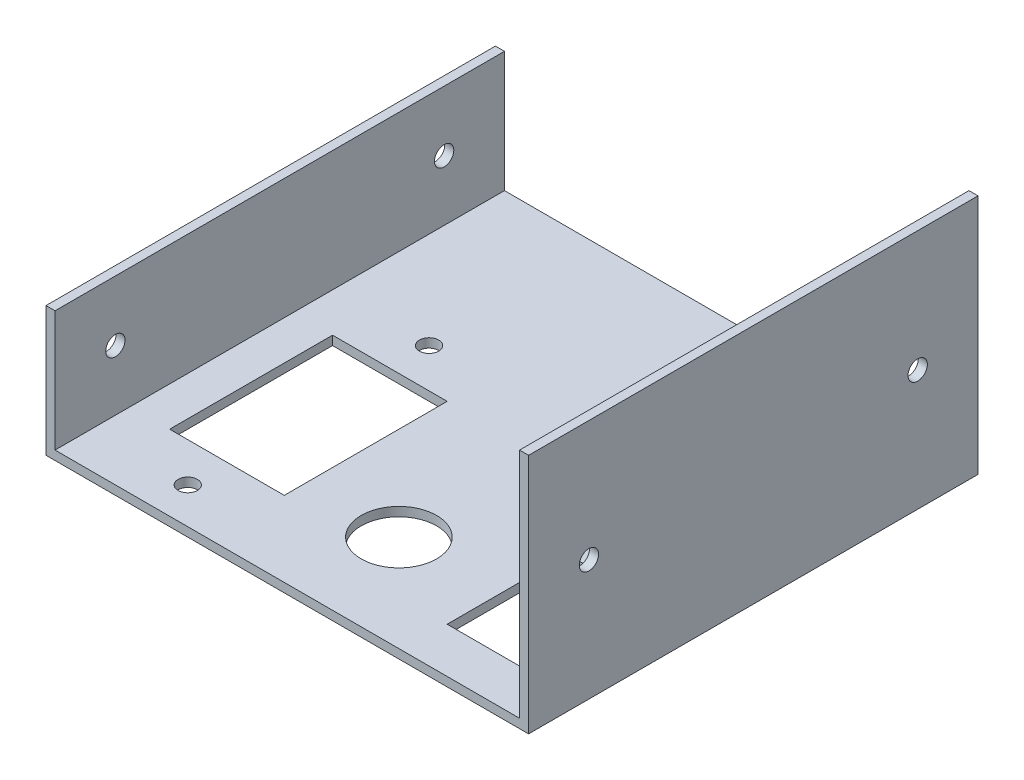
ISO-10303-21;
HEADER;
FILE_DESCRIPTION(('STEP AP214'),'2;1');
FILE_NAME('part.step','',(''),(''),'','','');
FILE_SCHEMA(('AUTOMOTIVE_DESIGN { 1 0 10303 214 1 1 1 1 }'));
ENDSEC;
DATA;
#1=APPLICATION_CONTEXT('core data for automotive mechanical design processes');
#2=APPLICATION_PROTOCOL_DEFINITION('international standard','automotive_design',2000,#1);
#3=PRODUCT_CONTEXT('',#1,'mechanical');
#4=PRODUCT('Part','Part','',(#3));
#5=PRODUCT_RELATED_PRODUCT_CATEGORY('part','',(#4));
#6=PRODUCT_DEFINITION_FORMATION('','',#4);
#7=PRODUCT_DEFINITION_CONTEXT('part definition',#1,'design');
#8=PRODUCT_DEFINITION('design','',#6,#7);
#9=PRODUCT_DEFINITION_SHAPE('','',#8);
#10=(LENGTH_UNIT() NAMED_UNIT(*) SI_UNIT(.MILLI.,.METRE.));
#11=(NAMED_UNIT(*) PLANE_ANGLE_UNIT() SI_UNIT($,.RADIAN.));
#12=(NAMED_UNIT(*) SI_UNIT($,.STERADIAN.) SOLID_ANGLE_UNIT());
#13=UNCERTAINTY_MEASURE_WITH_UNIT(LENGTH_MEASURE(1.E-05),#10,'distance_accuracy_value','');
#14=(GEOMETRIC_REPRESENTATION_CONTEXT(3) GLOBAL_UNCERTAINTY_ASSIGNED_CONTEXT((#13)) GLOBAL_UNIT_ASSIGNED_CONTEXT((#10,
#11,#12)) REPRESENTATION_CONTEXT('',''));
#15=CARTESIAN_POINT('',(0.,0.,0.));
#16=DIRECTION('',(0.,0.,1.));
#17=DIRECTION('',(1.,0.,0.));
#18=AXIS2_PLACEMENT_3D('',#15,#16,#17);
#19=CARTESIAN_POINT('',(0.,1.5,0.));
#20=DIRECTION('',(0.,-1.,0.));
#21=DIRECTION('',(0.,0.,-1.));
#22=AXIS2_PLACEMENT_3D('',#19,#20,#21);
#23=PLANE('',#22);
#24=DIRECTION('',(1.,0.,0.));
#25=VECTOR('',#24,1.);
#26=CARTESIAN_POINT('',(19.,1.5,29.75));
#27=LINE('',#26,#25);
#28=CARTESIAN_POINT('',(19.,1.5,29.75));
#29=VERTEX_POINT('',#28);
#30=CARTESIAN_POINT('',(31.,1.5,29.75));
#31=VERTEX_POINT('',#30);
#32=EDGE_CURVE('E160',#29,#31,#27,.T.);
#33=ORIENTED_EDGE('',*,*,#32,.F.);
#34=DIRECTION('',(0.,0.,1.));
#35=VECTOR('',#34,1.);
#36=CARTESIAN_POINT('',(19.,1.5,9.74999999999999));
#37=LINE('',#36,#35);
#38=CARTESIAN_POINT('',(19.,1.5,9.74999999999999));
#39=VERTEX_POINT('',#38);
#40=EDGE_CURVE('E51',#39,#29,#37,.T.);
#41=ORIENTED_EDGE('',*,*,#40,.F.);
#42=DIRECTION('',(-1.,0.,0.));
#43=VECTOR('',#42,1.);
#44=CARTESIAN_POINT('',(19.,1.5,9.74999999999999));
#45=LINE('',#44,#43);
#46=CARTESIAN_POINT('',(31.,1.5,9.74999999999999));
#47=VERTEX_POINT('',#46);
#48=EDGE_CURVE('E166',#47,#39,#45,.T.);
#49=ORIENTED_EDGE('',*,*,#48,.F.);
#50=DIRECTION('',(0.,0.,-1.));
#51=VECTOR('',#50,1.);
#52=CARTESIAN_POINT('',(31.,1.5,9.74999999999999));
#53=LINE('',#52,#51);
#54=EDGE_CURVE('E151',#31,#47,#53,.T.);
#55=ORIENTED_EDGE('',*,*,#54,.F.);
#56=EDGE_LOOP('',(#33,#41,#49,#55));
#57=FACE_BOUND('',#56,.T.);
#58=CARTESIAN_POINT('',(2.50000000000001,1.5,21.25));
#59=DIRECTION('',(0.,1.,0.));
#60=DIRECTION('',(0.,0.,1.));
#61=AXIS2_PLACEMENT_3D('',#58,#59,#60);
#62=CIRCLE('',#61,6.25);
#63=CARTESIAN_POINT('',(2.50000000000001,1.5,27.5));
#64=VERTEX_POINT('',#63);
#65=EDGE_CURVE('E173',#64,#64,#62,.T.);
#66=ORIENTED_EDGE('',*,*,#65,.F.);
#67=EDGE_LOOP('',(#66));
#68=FACE_BOUND('',#67,.T.);
#69=CARTESIAN_POINT('',(-22.5,1.5,31.25));
#70=DIRECTION('',(0.,1.,0.));
#71=DIRECTION('',(0.,0.,1.));
#72=AXIS2_PLACEMENT_3D('',#69,#70,#71);
#73=CIRCLE('',#72,1.6);
#74=CARTESIAN_POINT('',(-22.5,1.5,32.85));
#75=VERTEX_POINT('',#74);
#76=EDGE_CURVE('E179',#75,#75,#73,.T.);
#77=ORIENTED_EDGE('',*,*,#76,.F.);
#78=EDGE_LOOP('',(#77));
#79=FACE_BOUND('',#78,.T.);
#80=CARTESIAN_POINT('',(-22.5,1.5,-8.75000000000001));
#81=DIRECTION('',(0.,1.,0.));
#82=DIRECTION('',(0.,0.,1.));
#83=AXIS2_PLACEMENT_3D('',#80,#81,#82);
#84=CIRCLE('',#83,1.6);
#85=CARTESIAN_POINT('',(-22.5,1.5,-7.15000000000001));
#86=VERTEX_POINT('',#85);
#87=EDGE_CURVE('E183',#86,#86,#84,.T.);
#88=ORIENTED_EDGE('',*,*,#87,.F.);
#89=EDGE_LOOP('',(#88));
#90=FACE_BOUND('',#89,.T.);
#91=DIRECTION('',(1.,0.,0.));
#92=VECTOR('',#91,1.);
#93=CARTESIAN_POINT('',(-32.,1.5,24.75));
#94=LINE('',#93,#92);
#95=CARTESIAN_POINT('',(-32.,1.5,24.75));
#96=VERTEX_POINT('',#95);
#97=CARTESIAN_POINT('',(-13.,1.5,24.75));
#98=VERTEX_POINT('',#97);
#99=EDGE_CURVE('E189',#96,#98,#94,.T.);
#100=ORIENTED_EDGE('',*,*,#99,.F.);
#101=DIRECTION('',(0.,0.,1.));
#102=VECTOR('',#101,1.);
#103=CARTESIAN_POINT('',(-32.,1.5,-2.25));
#104=LINE('',#103,#102);
#105=CARTESIAN_POINT('',(-32.,1.5,-2.25));
#106=VERTEX_POINT('',#105);
#107=EDGE_CURVE('E187',#106,#96,#104,.T.);
#108=ORIENTED_EDGE('',*,*,#107,.F.);
#109=DIRECTION('',(-1.,0.,0.));
#110=VECTOR('',#109,1.);
#111=CARTESIAN_POINT('',(-32.,1.5,-2.25));
#112=LINE('',#111,#110);
#113=CARTESIAN_POINT('',(-13.,1.5,-2.25000000000001));
#114=VERTEX_POINT('',#113);
#115=EDGE_CURVE('E195',#114,#106,#112,.T.);
#116=ORIENTED_EDGE('',*,*,#115,.F.);
#117=DIRECTION('',(0.,0.,-1.));
#118=VECTOR('',#117,1.);
#119=CARTESIAN_POINT('',(-13.,1.5,-2.25000000000001));
#120=LINE('',#119,#118);
#121=EDGE_CURVE('E192',#98,#114,#120,.T.);
#122=ORIENTED_EDGE('',*,*,#121,.F.);
#123=EDGE_LOOP('',(#100,#108,#116,#122));
#124=FACE_BOUND('',#123,.T.);
#125=DIRECTION('',(0.,0.,1.));
#126=VECTOR('',#125,1.);
#127=CARTESIAN_POINT('',(38.5,1.5,-37.25));
#128=LINE('',#127,#126);
#129=CARTESIAN_POINT('',(38.5,1.5,-37.25));
#130=VERTEX_POINT('',#129);
#131=CARTESIAN_POINT('',(38.5,1.5,37.25));
#132=VERTEX_POINT('',#131);
#133=EDGE_CURVE('E201',#130,#132,#128,.T.);
#134=ORIENTED_EDGE('',*,*,#133,.F.);
#135=DIRECTION('',(-1.,0.,0.));
#136=VECTOR('',#135,1.);
#137=CARTESIAN_POINT('',(-40.,1.5,-37.25));
#138=LINE('',#137,#136);
#139=CARTESIAN_POINT('',(-38.5,1.5,-37.25));
#140=VERTEX_POINT('',#139);
#141=EDGE_CURVE('E258',#130,#140,#138,.T.);
#142=ORIENTED_EDGE('',*,*,#141,.T.);
#143=DIRECTION('',(0.,0.,-1.));
#144=VECTOR('',#143,1.);
#145=CARTESIAN_POINT('',(-38.5,1.5,-37.25));
#146=LINE('',#145,#144);
#147=CARTESIAN_POINT('',(-38.5,1.5,37.25));
#148=VERTEX_POINT('',#147);
#149=EDGE_CURVE('E226',#148,#140,#146,.T.);
#150=ORIENTED_EDGE('',*,*,#149,.F.);
#151=DIRECTION('',(1.,0.,0.));
#152=VECTOR('',#151,1.);
#153=CARTESIAN_POINT('',(-40.,1.5,37.25));
#154=LINE('',#153,#152);
#155=EDGE_CURVE('E246',#148,#132,#154,.T.);
#156=ORIENTED_EDGE('',*,*,#155,.T.);
#157=EDGE_LOOP('',(#134,#142,#150,#156));
#158=FACE_BOUND('',#157,.T.);
#159=ADVANCED_FACE('F34',(#57,#68,#79,#90,#124,#158),#23,.F.);
#160=CARTESIAN_POINT('',(40.,1.5,37.25));
#161=DIRECTION('',(-1.,0.,0.));
#162=DIRECTION('',(0.,0.,1.));
#163=AXIS2_PLACEMENT_3D('',#160,#161,#162);
#164=PLANE('',#163);
#165=CARTESIAN_POINT('',(40.,20.,-27.25));
#166=DIRECTION('',(1.,0.,0.));
#167=DIRECTION('',(0.,0.,-1.));
#168=AXIS2_PLACEMENT_3D('',#165,#166,#167);
#169=CIRCLE('',#168,1.6);
#170=CARTESIAN_POINT('',(40.,20.,-28.85));
#171=VERTEX_POINT('',#170);
#172=EDGE_CURVE('E300',#171,#171,#169,.T.);
#173=ORIENTED_EDGE('',*,*,#172,.F.);
#174=EDGE_LOOP('',(#173));
#175=FACE_BOUND('',#174,.T.);
#176=CARTESIAN_POINT('',(40.,20.,27.25));
#177=DIRECTION('',(1.,0.,0.));
#178=DIRECTION('',(0.,0.,-1.));
#179=AXIS2_PLACEMENT_3D('',#176,#177,#178);
#180=CIRCLE('',#179,1.6);
#181=CARTESIAN_POINT('',(40.,20.,25.65));
#182=VERTEX_POINT('',#181);
#183=EDGE_CURVE('E290',#182,#182,#180,.T.);
#184=ORIENTED_EDGE('',*,*,#183,.F.);
#185=EDGE_LOOP('',(#184));
#186=FACE_BOUND('',#185,.T.);
#187=DIRECTION('',(0.,0.,-1.));
#188=VECTOR('',#187,1.);
#189=CARTESIAN_POINT('',(40.,0.,37.25));
#190=LINE('',#189,#188);
#191=CARTESIAN_POINT('',(40.,0.,37.25));
#192=VERTEX_POINT('',#191);
#193=CARTESIAN_POINT('',(40.,0.,-37.25));
#194=VERTEX_POINT('',#193);
#195=EDGE_CURVE('E255',#192,#194,#190,.T.);
#196=ORIENTED_EDGE('',*,*,#195,.T.);
#197=DIRECTION('',(0.,-1.,0.));
#198=VECTOR('',#197,1.);
#199=CARTESIAN_POINT('',(40.,1.5,-37.25));
#200=LINE('',#199,#198);
#201=CARTESIAN_POINT('',(40.,40.,-37.25));
#202=VERTEX_POINT('',#201);
#203=EDGE_CURVE('E264',#202,#194,#200,.T.);
#204=ORIENTED_EDGE('',*,*,#203,.F.);
#205=DIRECTION('',(0.,0.,-1.));
#206=VECTOR('',#205,1.);
#207=CARTESIAN_POINT('',(40.,40.,-37.25));
#208=LINE('',#207,#206);
#209=CARTESIAN_POINT('',(40.,40.,37.25));
#210=VERTEX_POINT('',#209);
#211=EDGE_CURVE('E208',#210,#202,#208,.T.);
#212=ORIENTED_EDGE('',*,*,#211,.F.);
#213=DIRECTION('',(0.,-1.,0.));
#214=VECTOR('',#213,1.);
#215=CARTESIAN_POINT('',(40.,1.5,37.25));
#216=LINE('',#215,#214);
#217=EDGE_CURVE('E331',#210,#192,#216,.T.);
#218=ORIENTED_EDGE('',*,*,#217,.T.);
#219=EDGE_LOOP('',(#196,#204,#212,#218));
#220=FACE_BOUND('',#219,.T.);
#221=ADVANCED_FACE('F36',(#175,#186,#220),#164,.F.);
#222=CARTESIAN_POINT('',(-40.,1.5,-37.25));
#223=DIRECTION('',(0.,0.,1.));
#224=DIRECTION('',(1.,0.,0.));
#225=AXIS2_PLACEMENT_3D('',#222,#223,#224);
#226=PLANE('',#225);
#227=DIRECTION('',(-1.,0.,0.));
#228=VECTOR('',#227,1.);
#229=CARTESIAN_POINT('',(-40.,0.,-37.25));
#230=LINE('',#229,#228);
#231=CARTESIAN_POINT('',(-40.,0.,-37.25));
#232=VERTEX_POINT('',#231);
#233=EDGE_CURVE('E326',#194,#232,#230,.T.);
#234=ORIENTED_EDGE('',*,*,#233,.T.);
#235=DIRECTION('',(0.,-1.,0.));
#236=VECTOR('',#235,1.);
#237=CARTESIAN_POINT('',(-40.,1.5,-37.25));
#238=LINE('',#237,#236);
#239=CARTESIAN_POINT('',(-40.,21.5,-37.25));
#240=VERTEX_POINT('',#239);
#241=EDGE_CURVE('E323',#240,#232,#238,.T.);
#242=ORIENTED_EDGE('',*,*,#241,.F.);
#243=DIRECTION('',(-1.,0.,0.));
#244=VECTOR('',#243,1.);
#245=CARTESIAN_POINT('',(-40.,21.5,-37.25));
#246=LINE('',#245,#244);
#247=CARTESIAN_POINT('',(-38.5,21.5,-37.25));
#248=VERTEX_POINT('',#247);
#249=EDGE_CURVE('E234',#248,#240,#246,.T.);
#250=ORIENTED_EDGE('',*,*,#249,.F.);
#251=DIRECTION('',(0.,-1.,0.));
#252=VECTOR('',#251,1.);
#253=CARTESIAN_POINT('',(-38.5,21.5,-37.25));
#254=LINE('',#253,#252);
#255=EDGE_CURVE('E237',#248,#140,#254,.T.);
#256=ORIENTED_EDGE('',*,*,#255,.T.);
#257=ORIENTED_EDGE('',*,*,#141,.F.);
#258=DIRECTION('',(0.,-1.,0.));
#259=VECTOR('',#258,1.);
#260=CARTESIAN_POINT('',(38.5,40.,-37.25));
#261=LINE('',#260,#259);
#262=CARTESIAN_POINT('',(38.5,40.,-37.25));
#263=VERTEX_POINT('',#262);
#264=EDGE_CURVE('E223',#263,#130,#261,.T.);
#265=ORIENTED_EDGE('',*,*,#264,.F.);
#266=DIRECTION('',(-1.,0.,0.));
#267=VECTOR('',#266,1.);
#268=CARTESIAN_POINT('',(40.,40.,-37.25));
#269=LINE('',#268,#267);
#270=EDGE_CURVE('E211',#202,#263,#269,.T.);
#271=ORIENTED_EDGE('',*,*,#270,.F.);
#272=ORIENTED_EDGE('',*,*,#203,.T.);
#273=EDGE_LOOP('',(#234,#242,#250,#256,#257,#265,#271,#272));
#274=FACE_BOUND('',#273,.T.);
#275=ADVANCED_FACE('F313',(#274),#226,.F.);
#276=CARTESIAN_POINT('',(-40.,1.5,37.25));
#277=DIRECTION('',(1.,0.,0.));
#278=DIRECTION('',(0.,0.,-1.));
#279=AXIS2_PLACEMENT_3D('',#276,#277,#278);
#280=PLANE('',#279);
#281=CARTESIAN_POINT('',(-40.,11.5,-27.25));
#282=DIRECTION('',(-1.,0.,0.));
#283=DIRECTION('',(0.,0.,1.));
#284=AXIS2_PLACEMENT_3D('',#281,#282,#283);
#285=CIRCLE('',#284,1.6);
#286=CARTESIAN_POINT('',(-40.,11.5,-25.65));
#287=VERTEX_POINT('',#286);
#288=EDGE_CURVE('E287',#287,#287,#285,.T.);
#289=ORIENTED_EDGE('',*,*,#288,.F.);
#290=EDGE_LOOP('',(#289));
#291=FACE_BOUND('',#290,.T.);
#292=CARTESIAN_POINT('',(-40.,11.5,27.25));
#293=DIRECTION('',(-1.,0.,0.));
#294=DIRECTION('',(0.,0.,1.));
#295=AXIS2_PLACEMENT_3D('',#292,#293,#294);
#296=CIRCLE('',#295,1.6);
#297=CARTESIAN_POINT('',(-40.,11.5,28.85));
#298=VERTEX_POINT('',#297);
#299=EDGE_CURVE('E284',#298,#298,#296,.T.);
#300=ORIENTED_EDGE('',*,*,#299,.F.);
#301=EDGE_LOOP('',(#300));
#302=FACE_BOUND('',#301,.T.);
#303=DIRECTION('',(0.,0.,1.));
#304=VECTOR('',#303,1.);
#305=CARTESIAN_POINT('',(-40.,0.,37.25));
#306=LINE('',#305,#304);
#307=CARTESIAN_POINT('',(-40.,0.,37.25));
#308=VERTEX_POINT('',#307);
#309=EDGE_CURVE('E318',#232,#308,#306,.T.);
#310=ORIENTED_EDGE('',*,*,#309,.T.);
#311=DIRECTION('',(0.,-1.,0.));
#312=VECTOR('',#311,1.);
#313=CARTESIAN_POINT('',(-40.,1.5,37.25));
#314=LINE('',#313,#312);
#315=CARTESIAN_POINT('',(-40.,21.5,37.25));
#316=VERTEX_POINT('',#315);
#317=EDGE_CURVE('E321',#316,#308,#314,.T.);
#318=ORIENTED_EDGE('',*,*,#317,.F.);
#319=DIRECTION('',(0.,0.,1.));
#320=VECTOR('',#319,1.);
#321=CARTESIAN_POINT('',(-40.,21.5,-37.25));
#322=LINE('',#321,#320);
#323=EDGE_CURVE('E227',#240,#316,#322,.T.);
#324=ORIENTED_EDGE('',*,*,#323,.F.);
#325=ORIENTED_EDGE('',*,*,#241,.T.);
#326=EDGE_LOOP('',(#310,#318,#324,#325));
#327=FACE_BOUND('',#326,.T.);
#328=ADVANCED_FACE('F309',(#291,#302,#327),#280,.F.);
#329=CARTESIAN_POINT('',(-40.,1.5,37.25));
#330=DIRECTION('',(0.,0.,-1.));
#331=DIRECTION('',(-1.,0.,0.));
#332=AXIS2_PLACEMENT_3D('',#329,#330,#331);
#333=PLANE('',#332);
#334=DIRECTION('',(1.,0.,0.));
#335=VECTOR('',#334,1.);
#336=CARTESIAN_POINT('',(-40.,0.,37.25));
#337=LINE('',#336,#335);
#338=EDGE_CURVE('E260',#308,#192,#337,.T.);
#339=ORIENTED_EDGE('',*,*,#338,.T.);
#340=ORIENTED_EDGE('',*,*,#217,.F.);
#341=DIRECTION('',(1.,0.,0.));
#342=VECTOR('',#341,1.);
#343=CARTESIAN_POINT('',(40.,40.,37.25));
#344=LINE('',#343,#342);
#345=CARTESIAN_POINT('',(38.5,40.,37.25));
#346=VERTEX_POINT('',#345);
#347=EDGE_CURVE('E215',#346,#210,#344,.T.);
#348=ORIENTED_EDGE('',*,*,#347,.F.);
#349=DIRECTION('',(0.,-1.,0.));
#350=VECTOR('',#349,1.);
#351=CARTESIAN_POINT('',(38.5,40.,37.25));
#352=LINE('',#351,#350);
#353=EDGE_CURVE('E218',#346,#132,#352,.T.);
#354=ORIENTED_EDGE('',*,*,#353,.T.);
#355=ORIENTED_EDGE('',*,*,#155,.F.);
#356=DIRECTION('',(0.,-1.,0.));
#357=VECTOR('',#356,1.);
#358=CARTESIAN_POINT('',(-38.5,21.5,37.25));
#359=LINE('',#358,#357);
#360=CARTESIAN_POINT('',(-38.5,21.5,37.25));
#361=VERTEX_POINT('',#360);
#362=EDGE_CURVE('E250',#361,#148,#359,.T.);
#363=ORIENTED_EDGE('',*,*,#362,.F.);
#364=DIRECTION('',(1.,0.,0.));
#365=VECTOR('',#364,1.);
#366=CARTESIAN_POINT('',(-40.,21.5,37.25));
#367=LINE('',#366,#365);
#368=EDGE_CURVE('E230',#316,#361,#367,.T.);
#369=ORIENTED_EDGE('',*,*,#368,.F.);
#370=ORIENTED_EDGE('',*,*,#317,.T.);
#371=EDGE_LOOP('',(#339,#340,#348,#354,#355,#363,#369,#370));
#372=FACE_BOUND('',#371,.T.);
#373=ADVANCED_FACE('F312',(#372),#333,.F.);
#374=CARTESIAN_POINT('',(0.,0.,0.));
#375=DIRECTION('',(0.,-1.,0.));
#376=DIRECTION('',(0.,0.,-1.));
#377=AXIS2_PLACEMENT_3D('',#374,#375,#376);
#378=PLANE('',#377);
#379=DIRECTION('',(0.,0.,-1.));
#380=VECTOR('',#379,1.);
#381=CARTESIAN_POINT('',(19.,0.,0.));
#382=LINE('',#381,#380);
#383=CARTESIAN_POINT('',(19.,0.,29.75));
#384=VERTEX_POINT('',#383);
#385=CARTESIAN_POINT('',(19.,0.,9.74999999999999));
#386=VERTEX_POINT('',#385);
#387=EDGE_CURVE('E11',#384,#386,#382,.T.);
#388=ORIENTED_EDGE('',*,*,#387,.F.);
#389=DIRECTION('',(-1.,0.,0.));
#390=VECTOR('',#389,1.);
#391=CARTESIAN_POINT('',(0.,0.,29.75));
#392=LINE('',#391,#390);
#393=CARTESIAN_POINT('',(31.,0.,29.75));
#394=VERTEX_POINT('',#393);
#395=EDGE_CURVE('E271',#394,#384,#392,.T.);
#396=ORIENTED_EDGE('',*,*,#395,.F.);
#397=DIRECTION('',(0.,0.,1.));
#398=VECTOR('',#397,1.);
#399=CARTESIAN_POINT('',(31.,0.,0.));
#400=LINE('',#399,#398);
#401=CARTESIAN_POINT('',(31.,0.,9.74999999999999));
#402=VERTEX_POINT('',#401);
#403=EDGE_CURVE('E154',#402,#394,#400,.T.);
#404=ORIENTED_EDGE('',*,*,#403,.F.);
#405=DIRECTION('',(1.,0.,0.));
#406=VECTOR('',#405,1.);
#407=CARTESIAN_POINT('',(0.,0.,9.74999999999999));
#408=LINE('',#407,#406);
#409=EDGE_CURVE('E43',#386,#402,#408,.T.);
#410=ORIENTED_EDGE('',*,*,#409,.F.);
#411=EDGE_LOOP('',(#388,#396,#404,#410));
#412=FACE_BOUND('',#411,.T.);
#413=CARTESIAN_POINT('',(2.50000000000001,0.,21.25));
#414=DIRECTION('',(0.,-1.,0.));
#415=DIRECTION('',(0.,0.,-1.));
#416=AXIS2_PLACEMENT_3D('',#413,#414,#415);
#417=CIRCLE('',#416,6.25);
#418=CARTESIAN_POINT('',(2.50000000000001,0.,15.));
#419=VERTEX_POINT('',#418);
#420=EDGE_CURVE('E178',#419,#419,#417,.T.);
#421=ORIENTED_EDGE('',*,*,#420,.F.);
#422=EDGE_LOOP('',(#421));
#423=FACE_BOUND('',#422,.T.);
#424=CARTESIAN_POINT('',(-22.5,0.,31.25));
#425=DIRECTION('',(0.,-1.,0.));
#426=DIRECTION('',(0.,0.,-1.));
#427=AXIS2_PLACEMENT_3D('',#424,#425,#426);
#428=CIRCLE('',#427,1.6);
#429=CARTESIAN_POINT('',(-22.5,0.,29.65));
#430=VERTEX_POINT('',#429);
#431=EDGE_CURVE('E182',#430,#430,#428,.T.);
#432=ORIENTED_EDGE('',*,*,#431,.F.);
#433=EDGE_LOOP('',(#432));
#434=FACE_BOUND('',#433,.T.);
#435=CARTESIAN_POINT('',(-22.5,0.,-8.75000000000001));
#436=DIRECTION('',(0.,-1.,0.));
#437=DIRECTION('',(0.,0.,-1.));
#438=AXIS2_PLACEMENT_3D('',#435,#436,#437);
#439=CIRCLE('',#438,1.6);
#440=CARTESIAN_POINT('',(-22.5,0.,-10.35));
#441=VERTEX_POINT('',#440);
#442=EDGE_CURVE('E186',#441,#441,#439,.T.);
#443=ORIENTED_EDGE('',*,*,#442,.F.);
#444=EDGE_LOOP('',(#443));
#445=FACE_BOUND('',#444,.T.);
#446=DIRECTION('',(0.,0.,-1.));
#447=VECTOR('',#446,1.);
#448=CARTESIAN_POINT('',(-32.,0.,0.));
#449=LINE('',#448,#447);
#450=CARTESIAN_POINT('',(-32.,0.,24.75));
#451=VERTEX_POINT('',#450);
#452=CARTESIAN_POINT('',(-32.,0.,-2.25));
#453=VERTEX_POINT('',#452);
#454=EDGE_CURVE('E269',#451,#453,#449,.T.);
#455=ORIENTED_EDGE('',*,*,#454,.F.);
#456=DIRECTION('',(-1.,0.,0.));
#457=VECTOR('',#456,1.);
#458=CARTESIAN_POINT('',(0.,0.,24.75));
#459=LINE('',#458,#457);
#460=CARTESIAN_POINT('',(-13.,0.,24.75));
#461=VERTEX_POINT('',#460);
#462=EDGE_CURVE('E261',#461,#451,#459,.T.);
#463=ORIENTED_EDGE('',*,*,#462,.F.);
#464=DIRECTION('',(0.,0.,1.));
#465=VECTOR('',#464,1.);
#466=CARTESIAN_POINT('',(-13.,0.,0.));
#467=LINE('',#466,#465);
#468=CARTESIAN_POINT('',(-13.,0.,-2.25000000000001));
#469=VERTEX_POINT('',#468);
#470=EDGE_CURVE('E263',#469,#461,#467,.T.);
#471=ORIENTED_EDGE('',*,*,#470,.F.);
#472=DIRECTION('',(1.,0.,0.));
#473=VECTOR('',#472,1.);
#474=CARTESIAN_POINT('',(0.,0.,-2.25000000000001));
#475=LINE('',#474,#473);
#476=EDGE_CURVE('E267',#453,#469,#475,.T.);
#477=ORIENTED_EDGE('',*,*,#476,.F.);
#478=EDGE_LOOP('',(#455,#463,#471,#477));
#479=FACE_BOUND('',#478,.T.);
#480=ORIENTED_EDGE('',*,*,#195,.F.);
#481=ORIENTED_EDGE('',*,*,#338,.F.);
#482=ORIENTED_EDGE('',*,*,#309,.F.);
#483=ORIENTED_EDGE('',*,*,#233,.F.);
#484=EDGE_LOOP('',(#480,#481,#482,#483));
#485=FACE_BOUND('',#484,.T.);
#486=ADVANCED_FACE('F334',(#412,#423,#434,#445,#479,#485),#378,.T.);
#487=CARTESIAN_POINT('',(-38.5,21.5,-37.25));
#488=DIRECTION('',(-1.,0.,0.));
#489=DIRECTION('',(0.,0.,1.));
#490=AXIS2_PLACEMENT_3D('',#487,#488,#489);
#491=PLANE('',#490);
#492=CARTESIAN_POINT('',(-38.5,11.5,-27.25));
#493=DIRECTION('',(-1.,0.,0.));
#494=DIRECTION('',(0.,0.,1.));
#495=AXIS2_PLACEMENT_3D('',#492,#493,#494);
#496=CIRCLE('',#495,1.6);
#497=CARTESIAN_POINT('',(-38.5,11.5,-25.65));
#498=VERTEX_POINT('',#497);
#499=EDGE_CURVE('E285',#498,#498,#496,.T.);
#500=ORIENTED_EDGE('',*,*,#499,.T.);
#501=EDGE_LOOP('',(#500));
#502=FACE_BOUND('',#501,.T.);
#503=CARTESIAN_POINT('',(-38.5,11.5,27.25));
#504=DIRECTION('',(-1.,0.,0.));
#505=DIRECTION('',(0.,0.,1.));
#506=AXIS2_PLACEMENT_3D('',#503,#504,#505);
#507=CIRCLE('',#506,1.6);
#508=CARTESIAN_POINT('',(-38.5,11.5,28.85));
#509=VERTEX_POINT('',#508);
#510=EDGE_CURVE('E281',#509,#509,#507,.T.);
#511=ORIENTED_EDGE('',*,*,#510,.T.);
#512=EDGE_LOOP('',(#511));
#513=FACE_BOUND('',#512,.T.);
#514=ORIENTED_EDGE('',*,*,#149,.T.);
#515=ORIENTED_EDGE('',*,*,#255,.F.);
#516=DIRECTION('',(0.,0.,-1.));
#517=VECTOR('',#516,1.);
#518=CARTESIAN_POINT('',(-38.5,21.5,-37.25));
#519=LINE('',#518,#517);
#520=EDGE_CURVE('E232',#361,#248,#519,.T.);
#521=ORIENTED_EDGE('',*,*,#520,.F.);
#522=ORIENTED_EDGE('',*,*,#362,.T.);
#523=EDGE_LOOP('',(#514,#515,#521,#522));
#524=FACE_BOUND('',#523,.T.);
#525=ADVANCED_FACE('F359',(#502,#513,#524),#491,.F.);
#526=CARTESIAN_POINT('',(0.,21.5,0.));
#527=DIRECTION('',(0.,1.,0.));
#528=DIRECTION('',(0.,0.,1.));
#529=AXIS2_PLACEMENT_3D('',#526,#527,#528);
#530=PLANE('',#529);
#531=ORIENTED_EDGE('',*,*,#323,.T.);
#532=ORIENTED_EDGE('',*,*,#368,.T.);
#533=ORIENTED_EDGE('',*,*,#520,.T.);
#534=ORIENTED_EDGE('',*,*,#249,.T.);
#535=EDGE_LOOP('',(#531,#532,#533,#534));
#536=FACE_BOUND('',#535,.T.);
#537=ADVANCED_FACE('F363',(#536),#530,.T.);
#538=CARTESIAN_POINT('',(38.5,40.,-37.25));
#539=DIRECTION('',(1.,0.,0.));
#540=DIRECTION('',(0.,0.,-1.));
#541=AXIS2_PLACEMENT_3D('',#538,#539,#540);
#542=PLANE('',#541);
#543=CARTESIAN_POINT('',(38.5,20.,-27.25));
#544=DIRECTION('',(1.,0.,0.));
#545=DIRECTION('',(0.,0.,-1.));
#546=AXIS2_PLACEMENT_3D('',#543,#544,#545);
#547=CIRCLE('',#546,1.6);
#548=CARTESIAN_POINT('',(38.5,20.,-28.85));
#549=VERTEX_POINT('',#548);
#550=EDGE_CURVE('E38',#549,#549,#547,.T.);
#551=ORIENTED_EDGE('',*,*,#550,.T.);
#552=EDGE_LOOP('',(#551));
#553=FACE_BOUND('',#552,.T.);
#554=CARTESIAN_POINT('',(38.5,20.,27.25));
#555=DIRECTION('',(1.,0.,0.));
#556=DIRECTION('',(0.,0.,-1.));
#557=AXIS2_PLACEMENT_3D('',#554,#555,#556);
#558=CIRCLE('',#557,1.6);
#559=CARTESIAN_POINT('',(38.5,20.,25.65));
#560=VERTEX_POINT('',#559);
#561=EDGE_CURVE('E288',#560,#560,#558,.T.);
#562=ORIENTED_EDGE('',*,*,#561,.T.);
#563=EDGE_LOOP('',(#562));
#564=FACE_BOUND('',#563,.T.);
#565=ORIENTED_EDGE('',*,*,#133,.T.);
#566=ORIENTED_EDGE('',*,*,#353,.F.);
#567=DIRECTION('',(0.,0.,1.));
#568=VECTOR('',#567,1.);
#569=CARTESIAN_POINT('',(38.5,40.,-37.25));
#570=LINE('',#569,#568);
#571=EDGE_CURVE('E213',#263,#346,#570,.T.);
#572=ORIENTED_EDGE('',*,*,#571,.F.);
#573=ORIENTED_EDGE('',*,*,#264,.T.);
#574=EDGE_LOOP('',(#565,#566,#572,#573));
#575=FACE_BOUND('',#574,.T.);
#576=ADVANCED_FACE('F354',(#553,#564,#575),#542,.F.);
#577=CARTESIAN_POINT('',(0.,40.,0.));
#578=DIRECTION('',(0.,-1.,0.));
#579=DIRECTION('',(0.,0.,-1.));
#580=AXIS2_PLACEMENT_3D('',#577,#578,#579);
#581=PLANE('',#580);
#582=ORIENTED_EDGE('',*,*,#211,.T.);
#583=ORIENTED_EDGE('',*,*,#270,.T.);
#584=ORIENTED_EDGE('',*,*,#571,.T.);
#585=ORIENTED_EDGE('',*,*,#347,.T.);
#586=EDGE_LOOP('',(#582,#583,#584,#585));
#587=FACE_BOUND('',#586,.T.);
#588=ADVANCED_FACE('F350',(#587),#581,.F.);
#589=CARTESIAN_POINT('',(-32.,-38.5,-2.25));
#590=DIRECTION('',(-1.,0.,0.));
#591=DIRECTION('',(0.,0.,1.));
#592=AXIS2_PLACEMENT_3D('',#589,#590,#591);
#593=PLANE('',#592);
#594=ORIENTED_EDGE('',*,*,#454,.T.);
#595=DIRECTION('',(0.,1.,0.));
#596=VECTOR('',#595,1.);
#597=CARTESIAN_POINT('',(-32.,-38.5,-2.25));
#598=LINE('',#597,#596);
#599=EDGE_CURVE('E199',#453,#106,#598,.T.);
#600=ORIENTED_EDGE('',*,*,#599,.T.);
#601=ORIENTED_EDGE('',*,*,#107,.T.);
#602=DIRECTION('',(0.,1.,0.));
#603=VECTOR('',#602,1.);
#604=CARTESIAN_POINT('',(-32.,-38.5,24.75));
#605=LINE('',#604,#603);
#606=EDGE_CURVE('E198',#451,#96,#605,.T.);
#607=ORIENTED_EDGE('',*,*,#606,.F.);
#608=EDGE_LOOP('',(#594,#600,#601,#607));
#609=FACE_BOUND('',#608,.T.);
#610=ADVANCED_FACE('F423',(#609),#593,.F.);
#611=CARTESIAN_POINT('',(-32.,-38.5,-2.25));
#612=DIRECTION('',(0.,0.,-1.));
#613=DIRECTION('',(-1.,0.,0.));
#614=AXIS2_PLACEMENT_3D('',#611,#612,#613);
#615=PLANE('',#614);
#616=ORIENTED_EDGE('',*,*,#476,.T.);
#617=DIRECTION('',(0.,1.,0.));
#618=VECTOR('',#617,1.);
#619=CARTESIAN_POINT('',(-13.,-38.5,-2.25000000000001));
#620=LINE('',#619,#618);
#621=EDGE_CURVE('E202',#469,#114,#620,.T.);
#622=ORIENTED_EDGE('',*,*,#621,.T.);
#623=ORIENTED_EDGE('',*,*,#115,.T.);
#624=ORIENTED_EDGE('',*,*,#599,.F.);
#625=EDGE_LOOP('',(#616,#622,#623,#624));
#626=FACE_BOUND('',#625,.T.);
#627=ADVANCED_FACE('F429',(#626),#615,.F.);
#628=CARTESIAN_POINT('',(-13.,-38.5,-2.25000000000001));
#629=DIRECTION('',(1.,0.,0.));
#630=DIRECTION('',(0.,0.,-1.));
#631=AXIS2_PLACEMENT_3D('',#628,#629,#630);
#632=PLANE('',#631);
#633=ORIENTED_EDGE('',*,*,#470,.T.);
#634=DIRECTION('',(0.,1.,0.));
#635=VECTOR('',#634,1.);
#636=CARTESIAN_POINT('',(-13.,-38.5,24.75));
#637=LINE('',#636,#635);
#638=EDGE_CURVE('E204',#461,#98,#637,.T.);
#639=ORIENTED_EDGE('',*,*,#638,.T.);
#640=ORIENTED_EDGE('',*,*,#121,.T.);
#641=ORIENTED_EDGE('',*,*,#621,.F.);
#642=EDGE_LOOP('',(#633,#639,#640,#641));
#643=FACE_BOUND('',#642,.T.);
#644=ADVANCED_FACE('F437',(#643),#632,.F.);
#645=CARTESIAN_POINT('',(-32.,-38.5,24.75));
#646=DIRECTION('',(0.,0.,1.));
#647=DIRECTION('',(1.,0.,0.));
#648=AXIS2_PLACEMENT_3D('',#645,#646,#647);
#649=PLANE('',#648);
#650=ORIENTED_EDGE('',*,*,#462,.T.);
#651=ORIENTED_EDGE('',*,*,#606,.T.);
#652=ORIENTED_EDGE('',*,*,#99,.T.);
#653=ORIENTED_EDGE('',*,*,#638,.F.);
#654=EDGE_LOOP('',(#650,#651,#652,#653));
#655=FACE_BOUND('',#654,.T.);
#656=ADVANCED_FACE('F445',(#655),#649,.F.);
#657=CARTESIAN_POINT('',(-22.5,-38.5,-8.75000000000001));
#658=DIRECTION('',(0.,1.,0.));
#659=DIRECTION('',(0.,0.,1.));
#660=AXIS2_PLACEMENT_3D('',#657,#658,#659);
#661=CYLINDRICAL_SURFACE('',#660,1.6);
#662=ORIENTED_EDGE('',*,*,#442,.T.);
#663=EDGE_LOOP('',(#662));
#664=FACE_BOUND('',#663,.T.);
#665=ORIENTED_EDGE('',*,*,#87,.T.);
#666=EDGE_LOOP('',(#665));
#667=FACE_BOUND('',#666,.T.);
#668=ADVANCED_FACE('F453',(#664,#667),#661,.F.);
#669=CARTESIAN_POINT('',(-22.5,-38.5,31.25));
#670=DIRECTION('',(0.,1.,0.));
#671=DIRECTION('',(0.,0.,1.));
#672=AXIS2_PLACEMENT_3D('',#669,#670,#671);
#673=CYLINDRICAL_SURFACE('',#672,1.6);
#674=ORIENTED_EDGE('',*,*,#431,.T.);
#675=EDGE_LOOP('',(#674));
#676=FACE_BOUND('',#675,.T.);
#677=ORIENTED_EDGE('',*,*,#76,.T.);
#678=EDGE_LOOP('',(#677));
#679=FACE_BOUND('',#678,.T.);
#680=ADVANCED_FACE('F461',(#676,#679),#673,.F.);
#681=CARTESIAN_POINT('',(2.50000000000001,-38.5,21.25));
#682=DIRECTION('',(0.,1.,0.));
#683=DIRECTION('',(0.,0.,1.));
#684=AXIS2_PLACEMENT_3D('',#681,#682,#683);
#685=CYLINDRICAL_SURFACE('',#684,6.25);
#686=ORIENTED_EDGE('',*,*,#420,.T.);
#687=EDGE_LOOP('',(#686));
#688=FACE_BOUND('',#687,.T.);
#689=ORIENTED_EDGE('',*,*,#65,.T.);
#690=EDGE_LOOP('',(#689));
#691=FACE_BOUND('',#690,.T.);
#692=ADVANCED_FACE('F469',(#688,#691),#685,.F.);
#693=CARTESIAN_POINT('',(19.,-38.5,9.74999999999999));
#694=DIRECTION('',(-1.,0.,0.));
#695=DIRECTION('',(0.,0.,1.));
#696=AXIS2_PLACEMENT_3D('',#693,#694,#695);
#697=PLANE('',#696);
#698=ORIENTED_EDGE('',*,*,#387,.T.);
#699=DIRECTION('',(0.,1.,0.));
#700=VECTOR('',#699,1.);
#701=CARTESIAN_POINT('',(19.,-38.5,9.74999999999999));
#702=LINE('',#701,#700);
#703=EDGE_CURVE('E171',#386,#39,#702,.T.);
#704=ORIENTED_EDGE('',*,*,#703,.T.);
#705=ORIENTED_EDGE('',*,*,#40,.T.);
#706=DIRECTION('',(0.,1.,0.));
#707=VECTOR('',#706,1.);
#708=CARTESIAN_POINT('',(19.,-38.5,29.75));
#709=LINE('',#708,#707);
#710=EDGE_CURVE('E157',#384,#29,#709,.T.);
#711=ORIENTED_EDGE('',*,*,#710,.F.);
#712=EDGE_LOOP('',(#698,#704,#705,#711));
#713=FACE_BOUND('',#712,.T.);
#714=ADVANCED_FACE('F477',(#713),#697,.F.);
#715=CARTESIAN_POINT('',(19.,-38.5,9.74999999999999));
#716=DIRECTION('',(0.,0.,-1.));
#717=DIRECTION('',(-1.,0.,0.));
#718=AXIS2_PLACEMENT_3D('',#715,#716,#717);
#719=PLANE('',#718);
#720=ORIENTED_EDGE('',*,*,#409,.T.);
#721=DIRECTION('',(0.,1.,0.));
#722=VECTOR('',#721,1.);
#723=CARTESIAN_POINT('',(31.,-38.5,9.74999999999999));
#724=LINE('',#723,#722);
#725=EDGE_CURVE('E156',#402,#47,#724,.T.);
#726=ORIENTED_EDGE('',*,*,#725,.T.);
#727=ORIENTED_EDGE('',*,*,#48,.T.);
#728=ORIENTED_EDGE('',*,*,#703,.F.);
#729=EDGE_LOOP('',(#720,#726,#727,#728));
#730=FACE_BOUND('',#729,.T.);
#731=ADVANCED_FACE('F485',(#730),#719,.F.);
#732=CARTESIAN_POINT('',(31.,-38.5,9.74999999999999));
#733=DIRECTION('',(1.,0.,0.));
#734=DIRECTION('',(0.,0.,-1.));
#735=AXIS2_PLACEMENT_3D('',#732,#733,#734);
#736=PLANE('',#735);
#737=ORIENTED_EDGE('',*,*,#403,.T.);
#738=DIRECTION('',(0.,1.,0.));
#739=VECTOR('',#738,1.);
#740=CARTESIAN_POINT('',(31.,-38.5,29.75));
#741=LINE('',#740,#739);
#742=EDGE_CURVE('E59',#394,#31,#741,.T.);
#743=ORIENTED_EDGE('',*,*,#742,.T.);
#744=ORIENTED_EDGE('',*,*,#54,.T.);
#745=ORIENTED_EDGE('',*,*,#725,.F.);
#746=EDGE_LOOP('',(#737,#743,#744,#745));
#747=FACE_BOUND('',#746,.T.);
#748=ADVANCED_FACE('F148',(#747),#736,.F.);
#749=CARTESIAN_POINT('',(19.,-38.5,29.75));
#750=DIRECTION('',(0.,0.,1.));
#751=DIRECTION('',(1.,0.,0.));
#752=AXIS2_PLACEMENT_3D('',#749,#750,#751);
#753=PLANE('',#752);
#754=ORIENTED_EDGE('',*,*,#395,.T.);
#755=ORIENTED_EDGE('',*,*,#710,.T.);
#756=ORIENTED_EDGE('',*,*,#32,.T.);
#757=ORIENTED_EDGE('',*,*,#742,.F.);
#758=EDGE_LOOP('',(#754,#755,#756,#757));
#759=FACE_BOUND('',#758,.T.);
#760=ADVANCED_FACE('F161',(#759),#753,.F.);
#761=CARTESIAN_POINT('',(0.,11.5,27.25));
#762=DIRECTION('',(-1.,0.,0.));
#763=DIRECTION('',(0.,0.,1.));
#764=AXIS2_PLACEMENT_3D('',#761,#762,#763);
#765=CYLINDRICAL_SURFACE('',#764,1.6);
#766=ORIENTED_EDGE('',*,*,#299,.T.);
#767=EDGE_LOOP('',(#766));
#768=FACE_BOUND('',#767,.T.);
#769=ORIENTED_EDGE('',*,*,#510,.F.);
#770=EDGE_LOOP('',(#769));
#771=FACE_BOUND('',#770,.T.);
#772=ADVANCED_FACE('F306',(#768,#771),#765,.F.);
#773=CARTESIAN_POINT('',(0.,11.5,-27.25));
#774=DIRECTION('',(-1.,0.,0.));
#775=DIRECTION('',(0.,0.,1.));
#776=AXIS2_PLACEMENT_3D('',#773,#774,#775);
#777=CYLINDRICAL_SURFACE('',#776,1.6);
#778=ORIENTED_EDGE('',*,*,#288,.T.);
#779=EDGE_LOOP('',(#778));
#780=FACE_BOUND('',#779,.T.);
#781=ORIENTED_EDGE('',*,*,#499,.F.);
#782=EDGE_LOOP('',(#781));
#783=FACE_BOUND('',#782,.T.);
#784=ADVANCED_FACE('F509',(#780,#783),#777,.F.);
#785=CARTESIAN_POINT('',(0.,20.,27.25));
#786=DIRECTION('',(1.,0.,0.));
#787=DIRECTION('',(0.,0.,-1.));
#788=AXIS2_PLACEMENT_3D('',#785,#786,#787);
#789=CYLINDRICAL_SURFACE('',#788,1.6);
#790=ORIENTED_EDGE('',*,*,#183,.T.);
#791=EDGE_LOOP('',(#790));
#792=FACE_BOUND('',#791,.T.);
#793=ORIENTED_EDGE('',*,*,#561,.F.);
#794=EDGE_LOOP('',(#793));
#795=FACE_BOUND('',#794,.T.);
#796=ADVANCED_FACE('F516',(#792,#795),#789,.F.);
#797=CARTESIAN_POINT('',(0.,20.,-27.25));
#798=DIRECTION('',(1.,0.,0.));
#799=DIRECTION('',(0.,0.,-1.));
#800=AXIS2_PLACEMENT_3D('',#797,#798,#799);
#801=CYLINDRICAL_SURFACE('',#800,1.6);
#802=ORIENTED_EDGE('',*,*,#172,.T.);
#803=EDGE_LOOP('',(#802));
#804=FACE_BOUND('',#803,.T.);
#805=ORIENTED_EDGE('',*,*,#550,.F.);
#806=EDGE_LOOP('',(#805));
#807=FACE_BOUND('',#806,.T.);
#808=ADVANCED_FACE('F523',(#804,#807),#801,.F.);
#809=CLOSED_SHELL('',(#159,#221,#275,#328,#373,#486,#525,#537,#576,#588,#610,#627,#644,#656,
#668,#680,#692,#714,#731,#748,#760,#772,#784,#796,#808));
#810=MANIFOLD_SOLID_BREP('B2',#809);
#811=ADVANCED_BREP_SHAPE_REPRESENTATION('',(#18,#810),#14);
#812=SHAPE_DEFINITION_REPRESENTATION(#9,#811);
ENDSEC;
END-ISO-10303-21;
